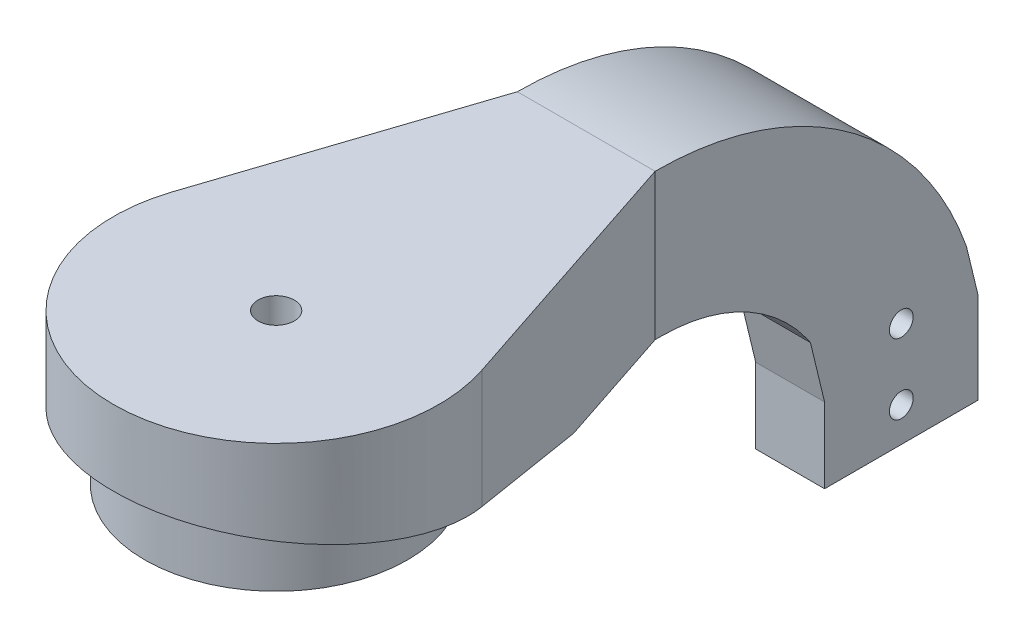
ISO-10303-21;
HEADER;
FILE_DESCRIPTION(('STEP AP214'),'2;1');
FILE_NAME('part.step','',(''),(''),'','','');
FILE_SCHEMA(('AUTOMOTIVE_DESIGN { 1 0 10303 214 1 1 1 1 }'));
ENDSEC;
DATA;
#1=APPLICATION_CONTEXT('core data for automotive mechanical design processes');
#2=APPLICATION_PROTOCOL_DEFINITION('international standard','automotive_design',2000,#1);
#3=PRODUCT_CONTEXT('',#1,'mechanical');
#4=PRODUCT('Part','Part','',(#3));
#5=PRODUCT_RELATED_PRODUCT_CATEGORY('part','',(#4));
#6=PRODUCT_DEFINITION_FORMATION('','',#4);
#7=PRODUCT_DEFINITION_CONTEXT('part definition',#1,'design');
#8=PRODUCT_DEFINITION('design','',#6,#7);
#9=PRODUCT_DEFINITION_SHAPE('','',#8);
#10=(LENGTH_UNIT() NAMED_UNIT(*) SI_UNIT(.MILLI.,.METRE.));
#11=(NAMED_UNIT(*) PLANE_ANGLE_UNIT() SI_UNIT($,.RADIAN.));
#12=(NAMED_UNIT(*) SI_UNIT($,.STERADIAN.) SOLID_ANGLE_UNIT());
#13=UNCERTAINTY_MEASURE_WITH_UNIT(LENGTH_MEASURE(1.E-05),#10,'distance_accuracy_value','');
#14=(GEOMETRIC_REPRESENTATION_CONTEXT(3) GLOBAL_UNCERTAINTY_ASSIGNED_CONTEXT((#13)) GLOBAL_UNIT_ASSIGNED_CONTEXT((#10,
#11,#12)) REPRESENTATION_CONTEXT('',''));
#15=CARTESIAN_POINT('',(0.,0.,0.));
#16=DIRECTION('',(0.,0.,1.));
#17=DIRECTION('',(1.,0.,0.));
#18=AXIS2_PLACEMENT_3D('',#15,#16,#17);
#19=CARTESIAN_POINT('',(0.,-6.,0.));
#20=DIRECTION('',(0.,1.,0.));
#21=DIRECTION('',(0.,0.,1.));
#22=AXIS2_PLACEMENT_3D('',#19,#20,#21);
#23=CYLINDRICAL_SURFACE('',#22,2.9);
#24=CARTESIAN_POINT('',(0.,24.,0.));
#25=DIRECTION('',(0.,1.,0.));
#26=DIRECTION('',(0.,0.,1.));
#27=AXIS2_PLACEMENT_3D('',#24,#25,#26);
#28=CIRCLE('',#27,2.9);
#29=CARTESIAN_POINT('',(0.,24.,2.9));
#30=VERTEX_POINT('',#29);
#31=EDGE_CURVE('E247',#30,#30,#28,.T.);
#32=ORIENTED_EDGE('',*,*,#31,.T.);
#33=EDGE_LOOP('',(#32));
#34=FACE_BOUND('',#33,.T.);
#35=CARTESIAN_POINT('',(0.,4.,0.));
#36=DIRECTION('',(0.,-1.,0.));
#37=DIRECTION('',(0.,0.,-1.));
#38=AXIS2_PLACEMENT_3D('',#35,#36,#37);
#39=CIRCLE('',#38,2.9);
#40=CARTESIAN_POINT('',(0.,4.,-2.9));
#41=VERTEX_POINT('',#40);
#42=EDGE_CURVE('E58',#41,#41,#39,.F.);
#43=ORIENTED_EDGE('',*,*,#42,.F.);
#44=EDGE_LOOP('',(#43));
#45=FACE_BOUND('',#44,.T.);
#46=ADVANCED_FACE('F54',(#34,#45),#23,.F.);
#47=CARTESIAN_POINT('',(26.,6.49412951597122,-1.30929194689402));
#48=DIRECTION('',(0.,0.980275685968542,-0.197634965274122));
#49=DIRECTION('',(0.,0.197634965274122,0.980275685968543));
#50=AXIS2_PLACEMENT_3D('',#47,#48,#49);
#51=PLANE('',#50);
#52=CARTESIAN_POINT('',(0.,6.75809798133453,0.));
#53=DIRECTION('',(0.,0.980275685968542,-0.197634965274122));
#54=DIRECTION('',(0.,-0.197634965274122,-0.980275685968543));
#55=AXIS2_PLACEMENT_3D('',#52,#53,#54);
#56=ELLIPSE('',#55,21.4225450050323,21.);
#57=CARTESIAN_POINT('',(0.,2.52425404318165,-21.));
#58=VERTEX_POINT('',#57);
#59=EDGE_CURVE('E367',#58,#58,#56,.T.);
#60=ORIENTED_EDGE('',*,*,#59,.T.);
#61=EDGE_LOOP('',(#60));
#62=FACE_BOUND('',#61,.T.);
#63=DIRECTION('',(-1.,0.,0.));
#64=VECTOR('',#63,1.);
#65=CARTESIAN_POINT('',(26.,0.691327287014724,-30.09137475112));
#66=LINE('',#65,#64);
#67=CARTESIAN_POINT('',(17.4291376058369,0.691327287014724,-30.09137475112));
#68=VERTEX_POINT('',#67);
#69=CARTESIAN_POINT('',(-17.4291376058369,0.691327287014724,-30.09137475112));
#70=VERTEX_POINT('',#69);
#71=EDGE_CURVE('E364',#68,#70,#66,.T.);
#72=ORIENTED_EDGE('',*,*,#71,.F.);
#73=DIRECTION('',(0.308550324285482,0.187991964008543,0.932446094340866));
#74=VECTOR('',#73,1.);
#75=CARTESIAN_POINT('',(26.8624970431234,6.43883629359479,-1.58354808076829));
#76=LINE('',#75,#74);
#77=CARTESIAN_POINT('',(24.6836947498382,5.11134677223549,-8.16793814232254));
#78=VERTEX_POINT('',#77);
#79=EDGE_CURVE('E342',#68,#78,#76,.T.);
#80=ORIENTED_EDGE('',*,*,#79,.T.);
#81=CARTESIAN_POINT('',(0.,6.75809798133453,0.));
#82=DIRECTION('',(0.,0.980275685968542,-0.197634965274122));
#83=DIRECTION('',(0.,0.197634965274122,0.980275685968543));
#84=AXIS2_PLACEMENT_3D('',#81,#82,#83);
#85=ELLIPSE('',#84,26.5231509586114,26.);
#86=CARTESIAN_POINT('',(-24.6836947498383,5.11134677223548,-8.16793814232254));
#87=VERTEX_POINT('',#86);
#88=EDGE_CURVE('E359',#87,#78,#85,.T.);
#89=ORIENTED_EDGE('',*,*,#88,.F.);
#90=DIRECTION('',(-0.308550324285482,0.187991964008543,0.932446094340866));
#91=VECTOR('',#90,1.);
#92=CARTESIAN_POINT('',(-21.9119253070563,3.42257725778396,-16.5442884097238));
#93=LINE('',#92,#91);
#94=EDGE_CURVE('E352',#70,#87,#93,.T.);
#95=ORIENTED_EDGE('',*,*,#94,.F.);
#96=EDGE_LOOP('',(#72,#80,#89,#95));
#97=FACE_BOUND('',#96,.T.);
#98=ADVANCED_FACE('F399',(#62,#97),#51,.F.);
#99=CARTESIAN_POINT('',(0.,24.,0.));
#100=DIRECTION('',(0.,1.,0.));
#101=DIRECTION('',(0.,0.,1.));
#102=AXIS2_PLACEMENT_3D('',#99,#100,#101);
#103=PLANE('',#102);
#104=ORIENTED_EDGE('',*,*,#31,.F.);
#105=EDGE_LOOP('',(#104));
#106=FACE_BOUND('',#105,.T.);
#107=DIRECTION('',(0.314151467012405,0.,0.949372874993779));
#108=VECTOR('',#107,1.);
#109=CARTESIAN_POINT('',(24.6836947498382,24.,-8.16793814232254));
#110=LINE('',#109,#108);
#111=CARTESIAN_POINT('',(11.,24.,-49.52037475112));
#112=VERTEX_POINT('',#111);
#113=CARTESIAN_POINT('',(24.6836947498382,24.,-8.16793814232254));
#114=VERTEX_POINT('',#113);
#115=EDGE_CURVE('E339',#112,#114,#110,.T.);
#116=ORIENTED_EDGE('',*,*,#115,.F.);
#117=DIRECTION('',(1.,0.,0.));
#118=VECTOR('',#117,1.);
#119=CARTESIAN_POINT('',(-26.,24.,-49.52037475112));
#120=LINE('',#119,#118);
#121=CARTESIAN_POINT('',(-11.,24.,-49.52037475112));
#122=VERTEX_POINT('',#121);
#123=EDGE_CURVE('E361',#122,#112,#120,.T.);
#124=ORIENTED_EDGE('',*,*,#123,.F.);
#125=DIRECTION('',(-0.314151467012406,0.,0.949372874993779));
#126=VECTOR('',#125,1.);
#127=CARTESIAN_POINT('',(-24.6836947498383,24.,-8.16793814232255));
#128=LINE('',#127,#126);
#129=CARTESIAN_POINT('',(-24.6836947498383,24.,-8.16793814232254));
#130=VERTEX_POINT('',#129);
#131=EDGE_CURVE('E348',#122,#130,#128,.T.);
#132=ORIENTED_EDGE('',*,*,#131,.T.);
#133=CARTESIAN_POINT('',(0.,24.,0.));
#134=DIRECTION('',(0.,1.,0.));
#135=DIRECTION('',(0.,0.,1.));
#136=AXIS2_PLACEMENT_3D('',#133,#134,#135);
#137=CIRCLE('',#136,26.);
#138=EDGE_CURVE('E357',#130,#114,#137,.T.);
#139=ORIENTED_EDGE('',*,*,#138,.T.);
#140=EDGE_LOOP('',(#116,#124,#132,#139));
#141=FACE_BOUND('',#140,.T.);
#142=ADVANCED_FACE('F405',(#106,#141),#103,.T.);
#143=CARTESIAN_POINT('',(-26.,0.691327287014724,-30.09137475112));
#144=DIRECTION('',(0.,-1.,0.));
#145=DIRECTION('',(0.,0.,-1.));
#146=AXIS2_PLACEMENT_3D('',#143,#144,#145);
#147=PLANE('',#146);
#148=DIRECTION('',(-0.314151467012405,0.,-0.949372874993779));
#149=VECTOR('',#148,1.);
#150=CARTESIAN_POINT('',(13.1430663227665,0.691327287014724,-43.0439796048678));
#151=LINE('',#150,#149);
#152=CARTESIAN_POINT('',(11.,0.691327287014724,-49.52037475112));
#153=VERTEX_POINT('',#152);
#154=EDGE_CURVE('E12',#68,#153,#151,.T.);
#155=ORIENTED_EDGE('',*,*,#154,.F.);
#156=ORIENTED_EDGE('',*,*,#71,.T.);
#157=DIRECTION('',(0.314151467012406,0.,-0.949372874993779));
#158=VECTOR('',#157,1.);
#159=CARTESIAN_POINT('',(-18.2750058225209,0.691327287014724,-27.5351417709716));
#160=LINE('',#159,#158);
#161=CARTESIAN_POINT('',(-11.,0.691327287014724,-49.52037475112));
#162=VERTEX_POINT('',#161);
#163=EDGE_CURVE('E63',#70,#162,#160,.T.);
#164=ORIENTED_EDGE('',*,*,#163,.T.);
#165=DIRECTION('',(0.,0.,-1.));
#166=VECTOR('',#165,1.);
#167=CARTESIAN_POINT('',(-11.,0.691327287014724,0.));
#168=LINE('',#167,#166);
#169=CARTESIAN_POINT('',(-11.,0.691327287014723,-50.4781448677158));
#170=VERTEX_POINT('',#169);
#171=EDGE_CURVE('E320',#162,#170,#168,.T.);
#172=ORIENTED_EDGE('',*,*,#171,.T.);
#173=DIRECTION('',(-1.,0.,0.));
#174=VECTOR('',#173,1.);
#175=CARTESIAN_POINT('',(11.,0.691327287014723,-50.4781448677158));
#176=LINE('',#175,#174);
#177=CARTESIAN_POINT('',(11.,0.691327287014723,-50.4781448677158));
#178=VERTEX_POINT('',#177);
#179=EDGE_CURVE('E328',#178,#170,#176,.T.);
#180=ORIENTED_EDGE('',*,*,#179,.F.);
#181=DIRECTION('',(0.,0.,-1.));
#182=VECTOR('',#181,1.);
#183=CARTESIAN_POINT('',(11.,0.691327287014724,0.));
#184=LINE('',#183,#182);
#185=EDGE_CURVE('E308',#153,#178,#184,.T.);
#186=ORIENTED_EDGE('',*,*,#185,.F.);
#187=EDGE_LOOP('',(#155,#156,#164,#172,#180,#186));
#188=FACE_BOUND('',#187,.T.);
#189=ADVANCED_FACE('F377',(#188),#147,.T.);
#190=CARTESIAN_POINT('',(0.,24.,0.));
#191=DIRECTION('',(0.,-1.,0.));
#192=DIRECTION('',(0.,0.,-1.));
#193=AXIS2_PLACEMENT_3D('',#190,#191,#192);
#194=CYLINDRICAL_SURFACE('',#193,21.);
#195=CARTESIAN_POINT('',(0.,0.,0.));
#196=DIRECTION('',(0.,1.,0.));
#197=DIRECTION('',(0.,0.,1.));
#198=AXIS2_PLACEMENT_3D('',#195,#196,#197);
#199=CIRCLE('',#198,21.);
#200=CARTESIAN_POINT('',(0.,0.,21.));
#201=VERTEX_POINT('',#200);
#202=EDGE_CURVE('E366',#201,#201,#199,.T.);
#203=ORIENTED_EDGE('',*,*,#202,.T.);
#204=EDGE_LOOP('',(#203));
#205=FACE_BOUND('',#204,.T.);
#206=ORIENTED_EDGE('',*,*,#59,.F.);
#207=EDGE_LOOP('',(#206));
#208=FACE_BOUND('',#207,.T.);
#209=ADVANCED_FACE('F56',(#205,#208),#194,.T.);
#210=CARTESIAN_POINT('',(0.,0.,0.));
#211=DIRECTION('',(0.,1.,0.));
#212=DIRECTION('',(0.,0.,1.));
#213=AXIS2_PLACEMENT_3D('',#210,#211,#212);
#214=PLANE('',#213);
#215=DIRECTION('',(-1.,0.,0.));
#216=VECTOR('',#215,1.);
#217=CARTESIAN_POINT('',(2.825,0.,4.89304353138208));
#218=LINE('',#217,#216);
#219=CARTESIAN_POINT('',(2.825,0.,4.89304353138208));
#220=VERTEX_POINT('',#219);
#221=CARTESIAN_POINT('',(-2.825,0.,4.89304353138208));
#222=VERTEX_POINT('',#221);
#223=EDGE_CURVE('E228',#220,#222,#218,.T.);
#224=ORIENTED_EDGE('',*,*,#223,.F.);
#225=DIRECTION('',(-0.5,0.,0.866025403784439));
#226=VECTOR('',#225,1.);
#227=CARTESIAN_POINT('',(5.65,0.,0.));
#228=LINE('',#227,#226);
#229=CARTESIAN_POINT('',(5.65,0.,0.));
#230=VERTEX_POINT('',#229);
#231=EDGE_CURVE('E70',#230,#220,#228,.T.);
#232=ORIENTED_EDGE('',*,*,#231,.F.);
#233=DIRECTION('',(0.5,0.,0.866025403784439));
#234=VECTOR('',#233,1.);
#235=CARTESIAN_POINT('',(2.825,0.,-4.89304353138208));
#236=LINE('',#235,#234);
#237=CARTESIAN_POINT('',(2.825,0.,-4.89304353138208));
#238=VERTEX_POINT('',#237);
#239=EDGE_CURVE('E214',#238,#230,#236,.T.);
#240=ORIENTED_EDGE('',*,*,#239,.F.);
#241=DIRECTION('',(1.,0.,0.));
#242=VECTOR('',#241,1.);
#243=CARTESIAN_POINT('',(-2.825,0.,-4.89304353138208));
#244=LINE('',#243,#242);
#245=CARTESIAN_POINT('',(-2.825,0.,-4.89304353138208));
#246=VERTEX_POINT('',#245);
#247=EDGE_CURVE('E217',#246,#238,#244,.T.);
#248=ORIENTED_EDGE('',*,*,#247,.F.);
#249=DIRECTION('',(0.5,0.,-0.866025403784439));
#250=VECTOR('',#249,1.);
#251=CARTESIAN_POINT('',(-5.65,0.,0.));
#252=LINE('',#251,#250);
#253=CARTESIAN_POINT('',(-5.65,0.,0.));
#254=VERTEX_POINT('',#253);
#255=EDGE_CURVE('E233',#254,#246,#252,.T.);
#256=ORIENTED_EDGE('',*,*,#255,.F.);
#257=DIRECTION('',(-0.5,0.,-0.866025403784439));
#258=VECTOR('',#257,1.);
#259=CARTESIAN_POINT('',(-2.825,0.,4.89304353138208));
#260=LINE('',#259,#258);
#261=EDGE_CURVE('E230',#222,#254,#260,.T.);
#262=ORIENTED_EDGE('',*,*,#261,.F.);
#263=EDGE_LOOP('',(#224,#232,#240,#248,#256,#262));
#264=FACE_BOUND('',#263,.T.);
#265=ORIENTED_EDGE('',*,*,#202,.F.);
#266=EDGE_LOOP('',(#265));
#267=FACE_BOUND('',#266,.T.);
#268=ADVANCED_FACE('F464',(#264,#267),#214,.F.);
#269=CARTESIAN_POINT('',(0.,0.,0.));
#270=DIRECTION('',(0.,1.,0.));
#271=DIRECTION('',(0.,0.,1.));
#272=AXIS2_PLACEMENT_3D('',#269,#270,#271);
#273=CYLINDRICAL_SURFACE('',#272,26.);
#274=ORIENTED_EDGE('',*,*,#88,.T.);
#275=DIRECTION('',(0.,1.,0.));
#276=VECTOR('',#275,1.);
#277=CARTESIAN_POINT('',(24.6836947498382,0.,-8.16793814232254));
#278=LINE('',#277,#276);
#279=EDGE_CURVE('E333',#78,#114,#278,.T.);
#280=ORIENTED_EDGE('',*,*,#279,.T.);
#281=ORIENTED_EDGE('',*,*,#138,.F.);
#282=DIRECTION('',(0.,1.,0.));
#283=VECTOR('',#282,1.);
#284=CARTESIAN_POINT('',(-24.6836947498383,0.,-8.16793814232254));
#285=LINE('',#284,#283);
#286=EDGE_CURVE('E345',#87,#130,#285,.T.);
#287=ORIENTED_EDGE('',*,*,#286,.F.);
#288=EDGE_LOOP('',(#274,#280,#281,#287));
#289=FACE_BOUND('',#288,.T.);
#290=ADVANCED_FACE('F403',(#289),#273,.T.);
#291=CARTESIAN_POINT('',(-24.6836947498383,0.,-8.16793814232255));
#292=DIRECTION('',(-0.949372874993779,0.,-0.314151467012406));
#293=DIRECTION('',(-0.314151467012406,0.,0.949372874993779));
#294=AXIS2_PLACEMENT_3D('',#291,#292,#293);
#295=PLANE('',#294);
#296=ORIENTED_EDGE('',*,*,#94,.T.);
#297=ORIENTED_EDGE('',*,*,#286,.T.);
#298=ORIENTED_EDGE('',*,*,#131,.F.);
#299=DIRECTION('',(0.,1.,0.));
#300=VECTOR('',#299,1.);
#301=CARTESIAN_POINT('',(-11.,0.,-49.52037475112));
#302=LINE('',#301,#300);
#303=EDGE_CURVE('E349',#162,#122,#302,.T.);
#304=ORIENTED_EDGE('',*,*,#303,.F.);
#305=ORIENTED_EDGE('',*,*,#163,.F.);
#306=EDGE_LOOP('',(#296,#297,#298,#304,#305));
#307=FACE_BOUND('',#306,.T.);
#308=ADVANCED_FACE('F401',(#307),#295,.T.);
#309=CARTESIAN_POINT('',(24.6836947498382,0.,-8.16793814232254));
#310=DIRECTION('',(-0.949372874993779,0.,0.314151467012405));
#311=DIRECTION('',(0.314151467012405,0.,0.949372874993779));
#312=AXIS2_PLACEMENT_3D('',#309,#310,#311);
#313=PLANE('',#312);
#314=ORIENTED_EDGE('',*,*,#154,.T.);
#315=DIRECTION('',(0.,1.,0.));
#316=VECTOR('',#315,1.);
#317=CARTESIAN_POINT('',(11.,0.,-49.52037475112));
#318=LINE('',#317,#316);
#319=EDGE_CURVE('E336',#153,#112,#318,.T.);
#320=ORIENTED_EDGE('',*,*,#319,.T.);
#321=ORIENTED_EDGE('',*,*,#115,.T.);
#322=ORIENTED_EDGE('',*,*,#279,.F.);
#323=ORIENTED_EDGE('',*,*,#79,.F.);
#324=EDGE_LOOP('',(#314,#320,#321,#322,#323));
#325=FACE_BOUND('',#324,.T.);
#326=ADVANCED_FACE('F396',(#325),#313,.F.);
#327=CARTESIAN_POINT('',(11.,-11.2534692294966,0.));
#328=DIRECTION('',(0.,-1.,0.));
#329=DIRECTION('',(0.,0.,-1.));
#330=AXIS2_PLACEMENT_3D('',#327,#328,#329);
#331=PLANE('',#330);
#332=DIRECTION('',(0.,0.,-1.));
#333=VECTOR('',#332,1.);
#334=CARTESIAN_POINT('',(0.,-11.2534692294966,0.));
#335=LINE('',#334,#333);
#336=CARTESIAN_POINT('',(0.,-11.2534692294966,-73.7487224420887));
#337=VERTEX_POINT('',#336);
#338=CARTESIAN_POINT('',(0.,-11.2534692294966,-99.2487224420887));
#339=VERTEX_POINT('',#338);
#340=EDGE_CURVE('E78',#337,#339,#335,.T.);
#341=ORIENTED_EDGE('',*,*,#340,.F.);
#342=DIRECTION('',(-1.,0.,0.));
#343=VECTOR('',#342,1.);
#344=CARTESIAN_POINT('',(11.,-11.2534692294966,-73.7487224420887));
#345=LINE('',#344,#343);
#346=CARTESIAN_POINT('',(-11.,-11.2534692294966,-73.7487224420887));
#347=VERTEX_POINT('',#346);
#348=EDGE_CURVE('E314',#337,#347,#345,.T.);
#349=ORIENTED_EDGE('',*,*,#348,.T.);
#350=DIRECTION('',(0.,0.,1.));
#351=VECTOR('',#350,1.);
#352=CARTESIAN_POINT('',(-11.,-11.2534692294966,0.));
#353=LINE('',#352,#351);
#354=CARTESIAN_POINT('',(-11.,-11.2534692294966,-99.2487224420887));
#355=VERTEX_POINT('',#354);
#356=EDGE_CURVE('E293',#355,#347,#353,.T.);
#357=ORIENTED_EDGE('',*,*,#356,.F.);
#358=DIRECTION('',(-1.,0.,0.));
#359=VECTOR('',#358,1.);
#360=CARTESIAN_POINT('',(11.,-11.2534692294966,-99.2487224420887));
#361=LINE('',#360,#359);
#362=EDGE_CURVE('E330',#339,#355,#361,.T.);
#363=ORIENTED_EDGE('',*,*,#362,.F.);
#364=EDGE_LOOP('',(#341,#349,#357,#363));
#365=FACE_BOUND('',#364,.T.);
#366=ADVANCED_FACE('F409',(#365),#331,.T.);
#367=CARTESIAN_POINT('',(11.,-28.7,-49.52037475112));
#368=DIRECTION('',(-1.,0.,0.));
#369=DIRECTION('',(0.,0.,1.));
#370=AXIS2_PLACEMENT_3D('',#367,#368,#369);
#371=CYLINDRICAL_SURFACE('',#370,52.7);
#372=CARTESIAN_POINT('',(-11.,-28.7,-49.52037475112));
#373=DIRECTION('',(1.,0.,0.));
#374=DIRECTION('',(0.,0.,-1.));
#375=AXIS2_PLACEMENT_3D('',#372,#373,#374);
#376=CIRCLE('',#375,52.7);
#377=EDGE_CURVE('E317',#355,#122,#376,.T.);
#378=ORIENTED_EDGE('',*,*,#377,.T.);
#379=ORIENTED_EDGE('',*,*,#123,.T.);
#380=CARTESIAN_POINT('',(11.,-28.7,-49.52037475112));
#381=DIRECTION('',(1.,0.,0.));
#382=DIRECTION('',(0.,0.,-1.));
#383=AXIS2_PLACEMENT_3D('',#380,#381,#382);
#384=CIRCLE('',#383,52.7);
#385=CARTESIAN_POINT('',(11.,-11.2534692294966,-99.2487224420887));
#386=VERTEX_POINT('',#385);
#387=EDGE_CURVE('E305',#386,#112,#384,.T.);
#388=ORIENTED_EDGE('',*,*,#387,.F.);
#389=EDGE_CURVE('E331',#386,#339,#361,.T.);
#390=ORIENTED_EDGE('',*,*,#389,.T.);
#391=ORIENTED_EDGE('',*,*,#362,.T.);
#392=EDGE_LOOP('',(#378,#379,#388,#390,#391));
#393=FACE_BOUND('',#392,.T.);
#394=ADVANCED_FACE('F408',(#393),#371,.T.);
#395=CARTESIAN_POINT('',(11.,-27.9486727129853,-50.4781448677158));
#396=DIRECTION('',(-1.,0.,0.));
#397=DIRECTION('',(0.,0.,1.));
#398=AXIS2_PLACEMENT_3D('',#395,#396,#397);
#399=CYLINDRICAL_SURFACE('',#398,28.64);
#400=CARTESIAN_POINT('',(-11.,-27.9486727129853,-50.4781448677158));
#401=DIRECTION('',(1.,0.,0.));
#402=DIRECTION('',(0.,0.,-1.));
#403=AXIS2_PLACEMENT_3D('',#400,#401,#402);
#404=CIRCLE('',#403,28.64);
#405=EDGE_CURVE('E309',#347,#170,#404,.T.);
#406=ORIENTED_EDGE('',*,*,#405,.F.);
#407=ORIENTED_EDGE('',*,*,#348,.F.);
#408=CARTESIAN_POINT('',(11.,-11.2534692294966,-73.7487224420887));
#409=VERTEX_POINT('',#408);
#410=EDGE_CURVE('E325',#409,#337,#345,.T.);
#411=ORIENTED_EDGE('',*,*,#410,.F.);
#412=CARTESIAN_POINT('',(11.,-27.9486727129853,-50.4781448677158));
#413=DIRECTION('',(1.,0.,0.));
#414=DIRECTION('',(0.,0.,-1.));
#415=AXIS2_PLACEMENT_3D('',#412,#413,#414);
#416=CIRCLE('',#415,28.64);
#417=EDGE_CURVE('E311',#409,#178,#416,.T.);
#418=ORIENTED_EDGE('',*,*,#417,.T.);
#419=ORIENTED_EDGE('',*,*,#179,.T.);
#420=EDGE_LOOP('',(#406,#407,#411,#418,#419));
#421=FACE_BOUND('',#420,.T.);
#422=ADVANCED_FACE('F388',(#421),#399,.F.);
#423=CARTESIAN_POINT('',(11.,0.,0.));
#424=DIRECTION('',(1.,0.,0.));
#425=DIRECTION('',(0.,0.,-1.));
#426=AXIS2_PLACEMENT_3D('',#423,#424,#425);
#427=PLANE('',#426);
#428=CARTESIAN_POINT('',(11.,-16.7283630840382,-88.8445880299439));
#429=DIRECTION('',(1.,0.,0.));
#430=DIRECTION('',(0.,0.,-1.));
#431=AXIS2_PLACEMENT_3D('',#428,#429,#430);
#432=CIRCLE('',#431,1.9);
#433=CARTESIAN_POINT('',(11.,-16.7283630840382,-90.7445880299439));
#434=VERTEX_POINT('',#433);
#435=EDGE_CURVE('E253',#434,#434,#432,.T.);
#436=ORIENTED_EDGE('',*,*,#435,.F.);
#437=EDGE_LOOP('',(#436));
#438=FACE_BOUND('',#437,.T.);
#439=CARTESIAN_POINT('',(11.,-27.9583630840382,-88.8445880299439));
#440=DIRECTION('',(1.,0.,0.));
#441=DIRECTION('',(0.,0.,-1.));
#442=AXIS2_PLACEMENT_3D('',#439,#440,#441);
#443=CIRCLE('',#442,1.9);
#444=CARTESIAN_POINT('',(11.,-27.9583630840382,-90.7445880299439));
#445=VERTEX_POINT('',#444);
#446=EDGE_CURVE('E259',#445,#445,#443,.T.);
#447=ORIENTED_EDGE('',*,*,#446,.F.);
#448=EDGE_LOOP('',(#447));
#449=FACE_BOUND('',#448,.T.);
#450=ORIENTED_EDGE('',*,*,#417,.F.);
#451=CARTESIAN_POINT('',(11.,-27.949247445101,-50.4773265261031));
#452=DIRECTION('',(1.,0.,0.));
#453=DIRECTION('',(0.,0.,-1.));
#454=AXIS2_PLACEMENT_3D('',#451,#452,#453);
#455=CIRCLE('',#454,28.641);
#456=CARTESIAN_POINT('',(11.,-12.0934830894777,-74.328985120401));
#457=VERTEX_POINT('',#456);
#458=EDGE_CURVE('E262',#457,#409,#455,.T.);
#459=ORIENTED_EDGE('',*,*,#458,.F.);
#460=DIRECTION('',(0.,0.971961000578549,0.235142113102579));
#461=VECTOR('',#460,1.);
#462=CARTESIAN_POINT('',(11.,16.3191418996678,-67.4552477227462));
#463=LINE('',#462,#461);
#464=CARTESIAN_POINT('',(11.,-21.4583630840382,-76.5945880299439));
#465=VERTEX_POINT('',#464);
#466=EDGE_CURVE('E281',#465,#457,#463,.T.);
#467=ORIENTED_EDGE('',*,*,#466,.F.);
#468=DIRECTION('',(0.,1.,0.));
#469=VECTOR('',#468,1.);
#470=CARTESIAN_POINT('',(11.,-1.77160573317754E-13,-76.594588029944));
#471=LINE('',#470,#469);
#472=CARTESIAN_POINT('',(11.,-33.4583630840382,-76.5945880299439));
#473=VERTEX_POINT('',#472);
#474=EDGE_CURVE('E283',#473,#465,#471,.T.);
#475=ORIENTED_EDGE('',*,*,#474,.F.);
#476=DIRECTION('',(0.,0.,1.));
#477=VECTOR('',#476,1.);
#478=CARTESIAN_POINT('',(11.,-33.4583630840382,0.));
#479=LINE('',#478,#477);
#480=CARTESIAN_POINT('',(11.,-33.4583630840382,-101.094588029944));
#481=VERTEX_POINT('',#480);
#482=EDGE_CURVE('E285',#481,#473,#479,.T.);
#483=ORIENTED_EDGE('',*,*,#482,.F.);
#484=DIRECTION('',(0.,-1.,0.));
#485=VECTOR('',#484,1.);
#486=CARTESIAN_POINT('',(11.,0.,-101.094588029944));
#487=LINE('',#486,#485);
#488=CARTESIAN_POINT('',(11.,-18.8833630840382,-101.094588029944));
#489=VERTEX_POINT('',#488);
#490=EDGE_CURVE('E287',#489,#481,#487,.T.);
#491=ORIENTED_EDGE('',*,*,#490,.F.);
#492=DIRECTION('',(0.,-0.97196100057855,-0.235142113102577));
#493=VECTOR('',#492,1.);
#494=CARTESIAN_POINT('',(11.,22.0609679255238,-91.1891118766529));
#495=LINE('',#494,#493);
#496=EDGE_CURVE('E267',#386,#489,#495,.T.);
#497=ORIENTED_EDGE('',*,*,#496,.F.);
#498=ORIENTED_EDGE('',*,*,#387,.T.);
#499=ORIENTED_EDGE('',*,*,#319,.F.);
#500=ORIENTED_EDGE('',*,*,#185,.T.);
#501=EDGE_LOOP('',(#450,#459,#467,#475,#483,#491,#497,#498,#499,#500));
#502=FACE_BOUND('',#501,.T.);
#503=ADVANCED_FACE('F393',(#438,#449,#502),#427,.T.);
#504=CARTESIAN_POINT('',(-11.,0.,0.));
#505=DIRECTION('',(1.,0.,0.));
#506=DIRECTION('',(0.,0.,-1.));
#507=AXIS2_PLACEMENT_3D('',#504,#505,#506);
#508=PLANE('',#507);
#509=ORIENTED_EDGE('',*,*,#356,.T.);
#510=ORIENTED_EDGE('',*,*,#405,.T.);
#511=ORIENTED_EDGE('',*,*,#171,.F.);
#512=ORIENTED_EDGE('',*,*,#303,.T.);
#513=ORIENTED_EDGE('',*,*,#377,.F.);
#514=EDGE_LOOP('',(#509,#510,#511,#512,#513));
#515=FACE_BOUND('',#514,.T.);
#516=ADVANCED_FACE('F383',(#515),#508,.F.);
#517=CARTESIAN_POINT('',(0.,-27.949247445101,-50.4773265261031));
#518=DIRECTION('',(1.,0.,0.));
#519=DIRECTION('',(0.,0.,-1.));
#520=AXIS2_PLACEMENT_3D('',#517,#518,#519);
#521=CYLINDRICAL_SURFACE('',#520,28.641);
#522=ORIENTED_EDGE('',*,*,#458,.T.);
#523=ORIENTED_EDGE('',*,*,#410,.T.);
#524=CARTESIAN_POINT('',(0.,-27.949247445101,-50.4773265261031));
#525=DIRECTION('',(1.,0.,0.));
#526=DIRECTION('',(0.,0.,-1.));
#527=AXIS2_PLACEMENT_3D('',#524,#525,#526);
#528=CIRCLE('',#527,28.641);
#529=CARTESIAN_POINT('',(0.,-12.0934830894777,-74.328985120401));
#530=VERTEX_POINT('',#529);
#531=EDGE_CURVE('E263',#530,#337,#528,.T.);
#532=ORIENTED_EDGE('',*,*,#531,.F.);
#533=DIRECTION('',(1.,0.,0.));
#534=VECTOR('',#533,1.);
#535=CARTESIAN_POINT('',(0.,-12.0934830894777,-74.328985120401));
#536=LINE('',#535,#534);
#537=EDGE_CURVE('E278',#530,#457,#536,.T.);
#538=ORIENTED_EDGE('',*,*,#537,.T.);
#539=EDGE_LOOP('',(#522,#523,#532,#538));
#540=FACE_BOUND('',#539,.T.);
#541=ADVANCED_FACE('F440',(#540),#521,.F.);
#542=CARTESIAN_POINT('',(0.,22.0609679255238,-91.1891118766529));
#543=DIRECTION('',(0.,-0.235142113102577,0.97196100057855));
#544=DIRECTION('',(0.,-0.97196100057855,-0.235142113102576));
#545=AXIS2_PLACEMENT_3D('',#542,#543,#544);
#546=PLANE('',#545);
#547=ORIENTED_EDGE('',*,*,#496,.T.);
#548=DIRECTION('',(1.,0.,0.));
#549=VECTOR('',#548,1.);
#550=CARTESIAN_POINT('',(0.,-18.8833630840382,-101.094588029944));
#551=LINE('',#550,#549);
#552=CARTESIAN_POINT('',(0.,-18.8833630840382,-101.094588029944));
#553=VERTEX_POINT('',#552);
#554=EDGE_CURVE('E290',#553,#489,#551,.T.);
#555=ORIENTED_EDGE('',*,*,#554,.F.);
#556=DIRECTION('',(0.,-0.97196100057855,-0.235142113102577));
#557=VECTOR('',#556,1.);
#558=CARTESIAN_POINT('',(0.,22.0609679255238,-91.1891118766529));
#559=LINE('',#558,#557);
#560=EDGE_CURVE('E275',#339,#553,#559,.T.);
#561=ORIENTED_EDGE('',*,*,#560,.F.);
#562=ORIENTED_EDGE('',*,*,#389,.F.);
#563=EDGE_LOOP('',(#547,#555,#561,#562));
#564=FACE_BOUND('',#563,.T.);
#565=ADVANCED_FACE('F417',(#564),#546,.F.);
#566=CARTESIAN_POINT('',(0.,0.,-101.094588029944));
#567=DIRECTION('',(0.,0.,1.));
#568=DIRECTION('',(1.,0.,0.));
#569=AXIS2_PLACEMENT_3D('',#566,#567,#568);
#570=PLANE('',#569);
#571=ORIENTED_EDGE('',*,*,#490,.T.);
#572=DIRECTION('',(1.,0.,0.));
#573=VECTOR('',#572,1.);
#574=CARTESIAN_POINT('',(0.,-33.4583630840382,-101.094588029944));
#575=LINE('',#574,#573);
#576=CARTESIAN_POINT('',(0.,-33.4583630840382,-101.094588029944));
#577=VERTEX_POINT('',#576);
#578=EDGE_CURVE('E294',#577,#481,#575,.T.);
#579=ORIENTED_EDGE('',*,*,#578,.F.);
#580=DIRECTION('',(0.,-1.,0.));
#581=VECTOR('',#580,1.);
#582=CARTESIAN_POINT('',(0.,0.,-101.094588029944));
#583=LINE('',#582,#581);
#584=EDGE_CURVE('E273',#553,#577,#583,.T.);
#585=ORIENTED_EDGE('',*,*,#584,.F.);
#586=ORIENTED_EDGE('',*,*,#554,.T.);
#587=EDGE_LOOP('',(#571,#579,#585,#586));
#588=FACE_BOUND('',#587,.T.);
#589=ADVANCED_FACE('F422',(#588),#570,.F.);
#590=CARTESIAN_POINT('',(0.,-33.4583630840382,0.));
#591=DIRECTION('',(0.,1.,0.));
#592=DIRECTION('',(0.,0.,1.));
#593=AXIS2_PLACEMENT_3D('',#590,#591,#592);
#594=PLANE('',#593);
#595=ORIENTED_EDGE('',*,*,#482,.T.);
#596=DIRECTION('',(1.,0.,0.));
#597=VECTOR('',#596,1.);
#598=CARTESIAN_POINT('',(0.,-33.4583630840382,-76.5945880299439));
#599=LINE('',#598,#597);
#600=CARTESIAN_POINT('',(0.,-33.4583630840382,-76.5945880299439));
#601=VERTEX_POINT('',#600);
#602=EDGE_CURVE('E297',#601,#473,#599,.T.);
#603=ORIENTED_EDGE('',*,*,#602,.F.);
#604=DIRECTION('',(0.,0.,1.));
#605=VECTOR('',#604,1.);
#606=CARTESIAN_POINT('',(0.,-33.4583630840382,0.));
#607=LINE('',#606,#605);
#608=EDGE_CURVE('E271',#577,#601,#607,.T.);
#609=ORIENTED_EDGE('',*,*,#608,.F.);
#610=ORIENTED_EDGE('',*,*,#578,.T.);
#611=EDGE_LOOP('',(#595,#603,#609,#610));
#612=FACE_BOUND('',#611,.T.);
#613=ADVANCED_FACE('F428',(#612),#594,.F.);
#614=CARTESIAN_POINT('',(0.,-1.77160573317754E-13,-76.594588029944));
#615=DIRECTION('',(0.,0.,-1.));
#616=DIRECTION('',(0.,1.,0.));
#617=AXIS2_PLACEMENT_3D('',#614,#615,#616);
#618=PLANE('',#617);
#619=ORIENTED_EDGE('',*,*,#474,.T.);
#620=DIRECTION('',(1.,0.,0.));
#621=VECTOR('',#620,1.);
#622=CARTESIAN_POINT('',(0.,-21.4583630840382,-76.5945880299439));
#623=LINE('',#622,#621);
#624=CARTESIAN_POINT('',(0.,-21.4583630840382,-76.5945880299439));
#625=VERTEX_POINT('',#624);
#626=EDGE_CURVE('E300',#625,#465,#623,.T.);
#627=ORIENTED_EDGE('',*,*,#626,.F.);
#628=DIRECTION('',(0.,1.,0.));
#629=VECTOR('',#628,1.);
#630=CARTESIAN_POINT('',(0.,-1.77160573317754E-13,-76.594588029944));
#631=LINE('',#630,#629);
#632=EDGE_CURVE('E269',#601,#625,#631,.T.);
#633=ORIENTED_EDGE('',*,*,#632,.F.);
#634=ORIENTED_EDGE('',*,*,#602,.T.);
#635=EDGE_LOOP('',(#619,#627,#633,#634));
#636=FACE_BOUND('',#635,.T.);
#637=ADVANCED_FACE('F432',(#636),#618,.F.);
#638=CARTESIAN_POINT('',(0.,16.3191418996678,-67.4552477227462));
#639=DIRECTION('',(0.,0.235142113102579,-0.971961000578549));
#640=DIRECTION('',(0.,0.971961000578549,0.235142113102579));
#641=AXIS2_PLACEMENT_3D('',#638,#639,#640);
#642=PLANE('',#641);
#643=ORIENTED_EDGE('',*,*,#466,.T.);
#644=ORIENTED_EDGE('',*,*,#537,.F.);
#645=DIRECTION('',(0.,0.971961000578549,0.235142113102579));
#646=VECTOR('',#645,1.);
#647=CARTESIAN_POINT('',(0.,16.3191418996678,-67.4552477227462));
#648=LINE('',#647,#646);
#649=EDGE_CURVE('E266',#625,#530,#648,.T.);
#650=ORIENTED_EDGE('',*,*,#649,.F.);
#651=ORIENTED_EDGE('',*,*,#626,.T.);
#652=EDGE_LOOP('',(#643,#644,#650,#651));
#653=FACE_BOUND('',#652,.T.);
#654=ADVANCED_FACE('F437',(#653),#642,.F.);
#655=CARTESIAN_POINT('',(0.,0.,0.));
#656=DIRECTION('',(1.,0.,0.));
#657=DIRECTION('',(0.,0.,-1.));
#658=AXIS2_PLACEMENT_3D('',#655,#656,#657);
#659=PLANE('',#658);
#660=CARTESIAN_POINT('',(0.,-16.7283630840382,-88.8445880299439));
#661=DIRECTION('',(-1.,0.,0.));
#662=DIRECTION('',(0.,0.,1.));
#663=AXIS2_PLACEMENT_3D('',#660,#661,#662);
#664=CIRCLE('',#663,1.9);
#665=CARTESIAN_POINT('',(0.,-16.7283630840382,-86.9445880299439));
#666=VERTEX_POINT('',#665);
#667=EDGE_CURVE('E250',#666,#666,#664,.T.);
#668=ORIENTED_EDGE('',*,*,#667,.F.);
#669=EDGE_LOOP('',(#668));
#670=FACE_BOUND('',#669,.T.);
#671=CARTESIAN_POINT('',(0.,-27.9583630840382,-88.8445880299439));
#672=DIRECTION('',(-1.,0.,0.));
#673=DIRECTION('',(0.,0.,1.));
#674=AXIS2_PLACEMENT_3D('',#671,#672,#673);
#675=CIRCLE('',#674,1.9);
#676=CARTESIAN_POINT('',(0.,-27.9583630840382,-86.9445880299439));
#677=VERTEX_POINT('',#676);
#678=EDGE_CURVE('E256',#677,#677,#675,.T.);
#679=ORIENTED_EDGE('',*,*,#678,.F.);
#680=EDGE_LOOP('',(#679));
#681=FACE_BOUND('',#680,.T.);
#682=ORIENTED_EDGE('',*,*,#531,.T.);
#683=ORIENTED_EDGE('',*,*,#340,.T.);
#684=ORIENTED_EDGE('',*,*,#560,.T.);
#685=ORIENTED_EDGE('',*,*,#584,.T.);
#686=ORIENTED_EDGE('',*,*,#608,.T.);
#687=ORIENTED_EDGE('',*,*,#632,.T.);
#688=ORIENTED_EDGE('',*,*,#649,.T.);
#689=EDGE_LOOP('',(#682,#683,#684,#685,#686,#687,#688));
#690=FACE_BOUND('',#689,.T.);
#691=ADVANCED_FACE('F412',(#670,#681,#690),#659,.F.);
#692=CARTESIAN_POINT('',(26.,-27.9583630840382,-88.8445880299439));
#693=DIRECTION('',(-1.,0.,0.));
#694=DIRECTION('',(0.,0.,1.));
#695=AXIS2_PLACEMENT_3D('',#692,#693,#694);
#696=CYLINDRICAL_SURFACE('',#695,1.9);
#697=ORIENTED_EDGE('',*,*,#446,.T.);
#698=EDGE_LOOP('',(#697));
#699=FACE_BOUND('',#698,.T.);
#700=ORIENTED_EDGE('',*,*,#678,.T.);
#701=EDGE_LOOP('',(#700));
#702=FACE_BOUND('',#701,.T.);
#703=ADVANCED_FACE('F510',(#699,#702),#696,.F.);
#704=CARTESIAN_POINT('',(26.,-16.7283630840382,-88.8445880299439));
#705=DIRECTION('',(-1.,0.,0.));
#706=DIRECTION('',(0.,0.,1.));
#707=AXIS2_PLACEMENT_3D('',#704,#705,#706);
#708=CYLINDRICAL_SURFACE('',#707,1.9);
#709=ORIENTED_EDGE('',*,*,#435,.T.);
#710=EDGE_LOOP('',(#709));
#711=FACE_BOUND('',#710,.T.);
#712=ORIENTED_EDGE('',*,*,#667,.T.);
#713=EDGE_LOOP('',(#712));
#714=FACE_BOUND('',#713,.T.);
#715=ADVANCED_FACE('F507',(#711,#714),#708,.F.);
#716=CARTESIAN_POINT('',(0.,4.,0.));
#717=DIRECTION('',(0.,-1.,0.));
#718=DIRECTION('',(0.,0.,-1.));
#719=AXIS2_PLACEMENT_3D('',#716,#717,#718);
#720=PLANE('',#719);
#721=DIRECTION('',(-0.5,0.,0.866025403784439));
#722=VECTOR('',#721,1.);
#723=CARTESIAN_POINT('',(5.65,4.,0.));
#724=LINE('',#723,#722);
#725=CARTESIAN_POINT('',(5.65,4.,0.));
#726=VERTEX_POINT('',#725);
#727=CARTESIAN_POINT('',(2.825,4.,4.89304353138208));
#728=VERTEX_POINT('',#727);
#729=EDGE_CURVE('E194',#726,#728,#724,.T.);
#730=ORIENTED_EDGE('',*,*,#729,.T.);
#731=DIRECTION('',(-1.,0.,0.));
#732=VECTOR('',#731,1.);
#733=CARTESIAN_POINT('',(2.825,4.,4.89304353138208));
#734=LINE('',#733,#732);
#735=CARTESIAN_POINT('',(-2.825,4.,4.89304353138208));
#736=VERTEX_POINT('',#735);
#737=EDGE_CURVE('E203',#728,#736,#734,.T.);
#738=ORIENTED_EDGE('',*,*,#737,.T.);
#739=DIRECTION('',(-0.5,0.,-0.866025403784439));
#740=VECTOR('',#739,1.);
#741=CARTESIAN_POINT('',(-2.825,4.,4.89304353138208));
#742=LINE('',#741,#740);
#743=CARTESIAN_POINT('',(-5.65,4.,0.));
#744=VERTEX_POINT('',#743);
#745=EDGE_CURVE('E208',#736,#744,#742,.T.);
#746=ORIENTED_EDGE('',*,*,#745,.T.);
#747=DIRECTION('',(0.5,0.,-0.866025403784439));
#748=VECTOR('',#747,1.);
#749=CARTESIAN_POINT('',(-5.65,4.,0.));
#750=LINE('',#749,#748);
#751=CARTESIAN_POINT('',(-2.825,4.,-4.89304353138208));
#752=VERTEX_POINT('',#751);
#753=EDGE_CURVE('E221',#744,#752,#750,.T.);
#754=ORIENTED_EDGE('',*,*,#753,.T.);
#755=DIRECTION('',(1.,0.,0.));
#756=VECTOR('',#755,1.);
#757=CARTESIAN_POINT('',(-2.825,4.,-4.89304353138208));
#758=LINE('',#757,#756);
#759=CARTESIAN_POINT('',(2.825,4.,-4.89304353138208));
#760=VERTEX_POINT('',#759);
#761=EDGE_CURVE('E224',#752,#760,#758,.T.);
#762=ORIENTED_EDGE('',*,*,#761,.T.);
#763=DIRECTION('',(0.5,0.,0.866025403784439));
#764=VECTOR('',#763,1.);
#765=CARTESIAN_POINT('',(2.825,4.,-4.89304353138208));
#766=LINE('',#765,#764);
#767=EDGE_CURVE('E200',#760,#726,#766,.T.);
#768=ORIENTED_EDGE('',*,*,#767,.T.);
#769=EDGE_LOOP('',(#730,#738,#746,#754,#762,#768));
#770=FACE_BOUND('',#769,.T.);
#771=ORIENTED_EDGE('',*,*,#42,.T.);
#772=EDGE_LOOP('',(#771));
#773=FACE_BOUND('',#772,.T.);
#774=ADVANCED_FACE('F210',(#770,#773),#720,.T.);
#775=CARTESIAN_POINT('',(5.65,4.,0.));
#776=DIRECTION('',(0.866025403784439,0.,0.5));
#777=DIRECTION('',(0.5,0.,-0.866025403784439));
#778=AXIS2_PLACEMENT_3D('',#775,#776,#777);
#779=PLANE('',#778);
#780=ORIENTED_EDGE('',*,*,#231,.T.);
#781=DIRECTION('',(0.,-1.,0.));
#782=VECTOR('',#781,1.);
#783=CARTESIAN_POINT('',(2.825,4.,4.89304353138208));
#784=LINE('',#783,#782);
#785=EDGE_CURVE('E190',#728,#220,#784,.T.);
#786=ORIENTED_EDGE('',*,*,#785,.F.);
#787=ORIENTED_EDGE('',*,*,#729,.F.);
#788=DIRECTION('',(0.,-1.,0.));
#789=VECTOR('',#788,1.);
#790=CARTESIAN_POINT('',(5.65,4.,0.));
#791=LINE('',#790,#789);
#792=EDGE_CURVE('E238',#726,#230,#791,.T.);
#793=ORIENTED_EDGE('',*,*,#792,.T.);
#794=EDGE_LOOP('',(#780,#786,#787,#793));
#795=FACE_BOUND('',#794,.T.);
#796=ADVANCED_FACE('F192',(#795),#779,.F.);
#797=CARTESIAN_POINT('',(2.825,4.,-4.89304353138208));
#798=DIRECTION('',(0.866025403784439,0.,-0.5));
#799=DIRECTION('',(-0.5,0.,-0.866025403784439));
#800=AXIS2_PLACEMENT_3D('',#797,#798,#799);
#801=PLANE('',#800);
#802=ORIENTED_EDGE('',*,*,#239,.T.);
#803=ORIENTED_EDGE('',*,*,#792,.F.);
#804=ORIENTED_EDGE('',*,*,#767,.F.);
#805=DIRECTION('',(0.,-1.,0.));
#806=VECTOR('',#805,1.);
#807=CARTESIAN_POINT('',(2.825,4.,-4.89304353138208));
#808=LINE('',#807,#806);
#809=EDGE_CURVE('E240',#760,#238,#808,.T.);
#810=ORIENTED_EDGE('',*,*,#809,.T.);
#811=EDGE_LOOP('',(#802,#803,#804,#810));
#812=FACE_BOUND('',#811,.T.);
#813=ADVANCED_FACE('F490',(#812),#801,.F.);
#814=CARTESIAN_POINT('',(-2.825,4.,-4.89304353138208));
#815=DIRECTION('',(0.,0.,-1.));
#816=DIRECTION('',(-1.,0.,0.));
#817=AXIS2_PLACEMENT_3D('',#814,#815,#816);
#818=PLANE('',#817);
#819=ORIENTED_EDGE('',*,*,#247,.T.);
#820=ORIENTED_EDGE('',*,*,#809,.F.);
#821=ORIENTED_EDGE('',*,*,#761,.F.);
#822=DIRECTION('',(0.,-1.,0.));
#823=VECTOR('',#822,1.);
#824=CARTESIAN_POINT('',(-2.825,4.,-4.89304353138208));
#825=LINE('',#824,#823);
#826=EDGE_CURVE('E242',#752,#246,#825,.T.);
#827=ORIENTED_EDGE('',*,*,#826,.T.);
#828=EDGE_LOOP('',(#819,#820,#821,#827));
#829=FACE_BOUND('',#828,.T.);
#830=ADVANCED_FACE('F488',(#829),#818,.F.);
#831=CARTESIAN_POINT('',(-5.65,4.,0.));
#832=DIRECTION('',(-0.866025403784439,0.,-0.5));
#833=DIRECTION('',(-0.5,0.,0.866025403784439));
#834=AXIS2_PLACEMENT_3D('',#831,#832,#833);
#835=PLANE('',#834);
#836=ORIENTED_EDGE('',*,*,#255,.T.);
#837=ORIENTED_EDGE('',*,*,#826,.F.);
#838=ORIENTED_EDGE('',*,*,#753,.F.);
#839=DIRECTION('',(0.,-1.,0.));
#840=VECTOR('',#839,1.);
#841=CARTESIAN_POINT('',(-5.65,4.,0.));
#842=LINE('',#841,#840);
#843=EDGE_CURVE('E244',#744,#254,#842,.T.);
#844=ORIENTED_EDGE('',*,*,#843,.T.);
#845=EDGE_LOOP('',(#836,#837,#838,#844));
#846=FACE_BOUND('',#845,.T.);
#847=ADVANCED_FACE('F486',(#846),#835,.F.);
#848=CARTESIAN_POINT('',(-2.825,4.,4.89304353138208));
#849=DIRECTION('',(-0.866025403784439,0.,0.5));
#850=DIRECTION('',(0.5,0.,0.866025403784439));
#851=AXIS2_PLACEMENT_3D('',#848,#849,#850);
#852=PLANE('',#851);
#853=ORIENTED_EDGE('',*,*,#261,.T.);
#854=ORIENTED_EDGE('',*,*,#843,.F.);
#855=ORIENTED_EDGE('',*,*,#745,.F.);
#856=DIRECTION('',(0.,-1.,0.));
#857=VECTOR('',#856,1.);
#858=CARTESIAN_POINT('',(-2.825,4.,4.89304353138208));
#859=LINE('',#858,#857);
#860=EDGE_CURVE('E199',#736,#222,#859,.T.);
#861=ORIENTED_EDGE('',*,*,#860,.T.);
#862=EDGE_LOOP('',(#853,#854,#855,#861));
#863=FACE_BOUND('',#862,.T.);
#864=ADVANCED_FACE('F482',(#863),#852,.F.);
#865=CARTESIAN_POINT('',(2.825,4.,4.89304353138208));
#866=DIRECTION('',(0.,0.,1.));
#867=DIRECTION('',(1.,0.,0.));
#868=AXIS2_PLACEMENT_3D('',#865,#866,#867);
#869=PLANE('',#868);
#870=ORIENTED_EDGE('',*,*,#223,.T.);
#871=ORIENTED_EDGE('',*,*,#860,.F.);
#872=ORIENTED_EDGE('',*,*,#737,.F.);
#873=ORIENTED_EDGE('',*,*,#785,.T.);
#874=EDGE_LOOP('',(#870,#871,#872,#873));
#875=FACE_BOUND('',#874,.T.);
#876=ADVANCED_FACE('F204',(#875),#869,.F.);
#877=CLOSED_SHELL('',(#46,#98,#142,#189,#209,#268,#290,#308,#326,#366,#394,#422,#503,#516,#541,
#565,#589,#613,#637,#654,#691,#703,#715,#774,#796,#813,#830,#847,#864,#876));
#878=MANIFOLD_SOLID_BREP('B2',#877);
#879=ADVANCED_BREP_SHAPE_REPRESENTATION('',(#18,#878),#14);
#880=SHAPE_DEFINITION_REPRESENTATION(#9,#879);
ENDSEC;
END-ISO-10303-21;
